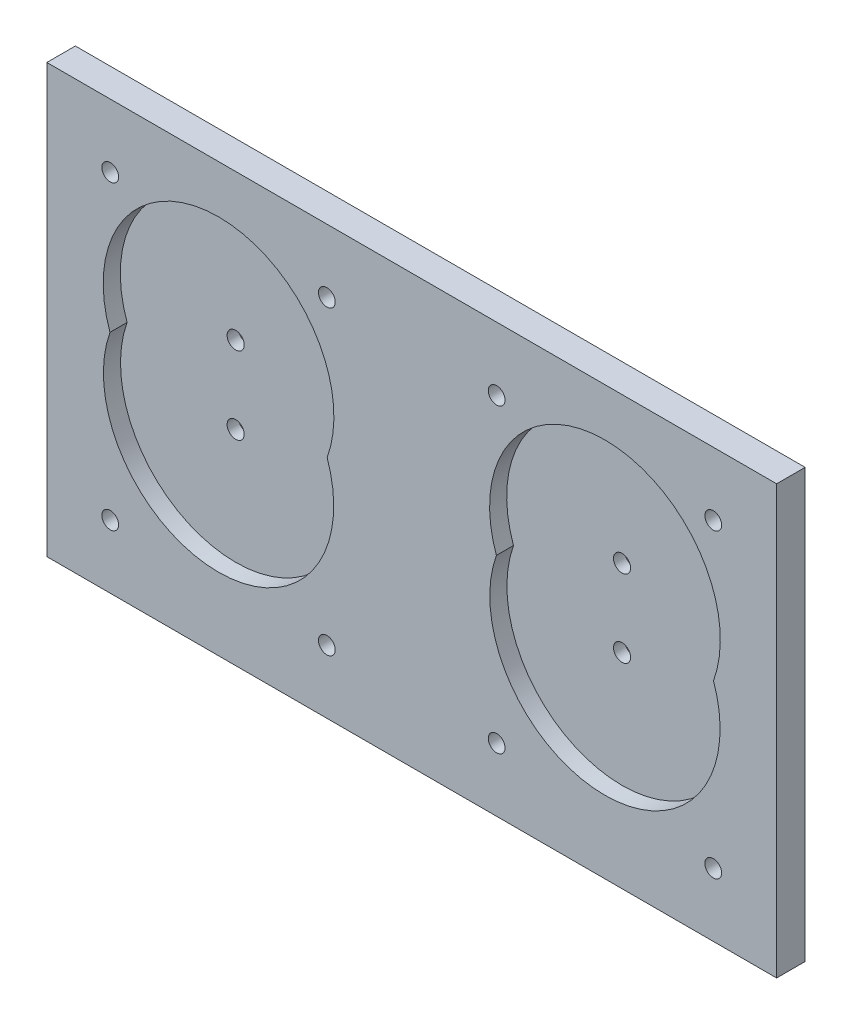
ISO-10303-21;
HEADER;
FILE_DESCRIPTION(('STEP AP214'),'2;1');
FILE_NAME('part.step','',(''),(''),'','','');
FILE_SCHEMA(('AUTOMOTIVE_DESIGN { 1 0 10303 214 1 1 1 1 }'));
ENDSEC;
DATA;
#1=APPLICATION_CONTEXT('core data for automotive mechanical design processes');
#2=APPLICATION_PROTOCOL_DEFINITION('international standard','automotive_design',2000,#1);
#3=PRODUCT_CONTEXT('',#1,'mechanical');
#4=PRODUCT('Part','Part','',(#3));
#5=PRODUCT_RELATED_PRODUCT_CATEGORY('part','',(#4));
#6=PRODUCT_DEFINITION_FORMATION('','',#4);
#7=PRODUCT_DEFINITION_CONTEXT('part definition',#1,'design');
#8=PRODUCT_DEFINITION('design','',#6,#7);
#9=PRODUCT_DEFINITION_SHAPE('','',#8);
#10=(LENGTH_UNIT() NAMED_UNIT(*) SI_UNIT(.MILLI.,.METRE.));
#11=(NAMED_UNIT(*) PLANE_ANGLE_UNIT() SI_UNIT($,.RADIAN.));
#12=(NAMED_UNIT(*) SI_UNIT($,.STERADIAN.) SOLID_ANGLE_UNIT());
#13=UNCERTAINTY_MEASURE_WITH_UNIT(LENGTH_MEASURE(1.E-05),#10,'distance_accuracy_value','');
#14=(GEOMETRIC_REPRESENTATION_CONTEXT(3) GLOBAL_UNCERTAINTY_ASSIGNED_CONTEXT((#13)) GLOBAL_UNIT_ASSIGNED_CONTEXT((#10,
#11,#12)) REPRESENTATION_CONTEXT('',''));
#15=CARTESIAN_POINT('',(0.,0.,0.));
#16=DIRECTION('',(0.,0.,1.));
#17=DIRECTION('',(1.,0.,0.));
#18=AXIS2_PLACEMENT_3D('',#15,#16,#17);
#19=CARTESIAN_POINT('',(-4.50000190126662,2.42973090307518,5.));
#20=DIRECTION('',(0.,0.,-1.));
#21=DIRECTION('',(-1.,0.,0.));
#22=AXIS2_PLACEMENT_3D('',#19,#20,#21);
#23=CYLINDRICAL_SURFACE('',#22,20.1998483211657);
#24=DIRECTION('',(0.,0.,-1.));
#25=VECTOR('',#24,1.);
#26=CARTESIAN_POINT('',(14.5464383030136,9.15780549710871,5.));
#27=LINE('',#26,#25);
#28=CARTESIAN_POINT('',(14.5464383030136,9.15780549710871,5.));
#29=VERTEX_POINT('',#28);
#30=CARTESIAN_POINT('',(14.5464383030136,9.15780549710871,2.));
#31=VERTEX_POINT('',#30);
#32=EDGE_CURVE('E51',#29,#31,#27,.T.);
#33=ORIENTED_EDGE('',*,*,#32,.T.);
#34=CARTESIAN_POINT('',(-4.50000190126662,2.42973090307518,2.));
#35=DIRECTION('',(0.,0.,-1.));
#36=DIRECTION('',(-1.,0.,0.));
#37=AXIS2_PLACEMENT_3D('',#34,#35,#36);
#38=CIRCLE('',#37,20.1998483211657);
#39=CARTESIAN_POINT('',(-23.5464817883785,9.15769315831589,2.));
#40=VERTEX_POINT('',#39);
#41=EDGE_CURVE('E58',#31,#40,#38,.T.);
#42=ORIENTED_EDGE('',*,*,#41,.T.);
#43=DIRECTION('',(0.,0.,-1.));
#44=VECTOR('',#43,1.);
#45=CARTESIAN_POINT('',(-23.5464817883785,9.15769315831589,5.));
#46=LINE('',#45,#44);
#47=CARTESIAN_POINT('',(-23.5464817883785,9.15769315831589,5.));
#48=VERTEX_POINT('',#47);
#49=EDGE_CURVE('E11',#48,#40,#46,.T.);
#50=ORIENTED_EDGE('',*,*,#49,.F.);
#51=CARTESIAN_POINT('',(-4.50000190126662,2.42973090307518,5.));
#52=DIRECTION('',(0.,0.,1.));
#53=DIRECTION('',(1.,0.,0.));
#54=AXIS2_PLACEMENT_3D('',#51,#52,#53);
#55=CIRCLE('',#54,20.1998483211657);
#56=EDGE_CURVE('E126',#48,#29,#55,.T.);
#57=ORIENTED_EDGE('',*,*,#56,.T.);
#58=EDGE_LOOP('',(#33,#42,#50,#57));
#59=FACE_BOUND('',#58,.T.);
#60=ADVANCED_FACE('F41',(#59),#23,.F.);
#61=CARTESIAN_POINT('',(-4.50004190388904,15.9942054839587,5.));
#62=DIRECTION('',(0.,0.,-1.));
#63=DIRECTION('',(-1.,0.,0.));
#64=AXIS2_PLACEMENT_3D('',#61,#62,#63);
#65=CYLINDRICAL_SURFACE('',#64,20.2362242785589);
#66=ORIENTED_EDGE('',*,*,#49,.T.);
#67=CARTESIAN_POINT('',(-4.50004190388904,15.9942054839587,2.));
#68=DIRECTION('',(0.,0.,-1.));
#69=DIRECTION('',(-1.,0.,0.));
#70=AXIS2_PLACEMENT_3D('',#67,#68,#69);
#71=CIRCLE('',#70,20.2362242785589);
#72=EDGE_CURVE('E106',#40,#31,#71,.T.);
#73=ORIENTED_EDGE('',*,*,#72,.T.);
#74=ORIENTED_EDGE('',*,*,#32,.F.);
#75=CARTESIAN_POINT('',(-4.50004190388904,15.9942054839587,5.));
#76=DIRECTION('',(0.,0.,1.));
#77=DIRECTION('',(1.,0.,0.));
#78=AXIS2_PLACEMENT_3D('',#75,#76,#77);
#79=CIRCLE('',#78,20.2362242785589);
#80=EDGE_CURVE('E122',#29,#48,#79,.T.);
#81=ORIENTED_EDGE('',*,*,#80,.T.);
#82=EDGE_LOOP('',(#66,#73,#74,#81));
#83=FACE_BOUND('',#82,.T.);
#84=ADVANCED_FACE('F120',(#83),#65,.F.);
#85=CARTESIAN_POINT('',(63.2845897595525,15.9942054839587,5.));
#86=DIRECTION('',(0.,0.,-1.));
#87=DIRECTION('',(-1.,0.,0.));
#88=AXIS2_PLACEMENT_3D('',#85,#86,#87);
#89=CYLINDRICAL_SURFACE('',#88,20.2362242785589);
#90=DIRECTION('',(0.,0.,-1.));
#91=VECTOR('',#90,1.);
#92=CARTESIAN_POINT('',(44.2381095526499,9.15780549710872,5.));
#93=LINE('',#92,#91);
#94=CARTESIAN_POINT('',(44.2381095526499,9.15780549710872,5.));
#95=VERTEX_POINT('',#94);
#96=CARTESIAN_POINT('',(44.2381095526499,9.15780549710872,2.));
#97=VERTEX_POINT('',#96);
#98=EDGE_CURVE('E125',#95,#97,#93,.T.);
#99=ORIENTED_EDGE('',*,*,#98,.T.);
#100=CARTESIAN_POINT('',(63.2845897595525,15.9942054839587,2.));
#101=DIRECTION('',(0.,0.,-1.));
#102=DIRECTION('',(-1.,0.,0.));
#103=AXIS2_PLACEMENT_3D('',#100,#101,#102);
#104=CIRCLE('',#103,20.2362242785589);
#105=CARTESIAN_POINT('',(82.3310296440419,9.15769315831589,2.));
#106=VERTEX_POINT('',#105);
#107=EDGE_CURVE('E65',#97,#106,#104,.T.);
#108=ORIENTED_EDGE('',*,*,#107,.T.);
#109=DIRECTION('',(0.,0.,-1.));
#110=VECTOR('',#109,1.);
#111=CARTESIAN_POINT('',(82.3310296440419,9.15769315831588,5.));
#112=LINE('',#111,#110);
#113=CARTESIAN_POINT('',(82.3310296440419,9.15769315831588,5.));
#114=VERTEX_POINT('',#113);
#115=EDGE_CURVE('E131',#114,#106,#112,.T.);
#116=ORIENTED_EDGE('',*,*,#115,.F.);
#117=CARTESIAN_POINT('',(63.2845897595525,15.9942054839587,5.));
#118=DIRECTION('',(0.,0.,1.));
#119=DIRECTION('',(1.,0.,0.));
#120=AXIS2_PLACEMENT_3D('',#117,#118,#119);
#121=CIRCLE('',#120,20.2362242785589);
#122=EDGE_CURVE('E153',#114,#95,#121,.T.);
#123=ORIENTED_EDGE('',*,*,#122,.T.);
#124=EDGE_LOOP('',(#99,#108,#116,#123));
#125=FACE_BOUND('',#124,.T.);
#126=ADVANCED_FACE('F43',(#125),#89,.F.);
#127=CARTESIAN_POINT('',(63.28454975693,2.42973090307519,5.));
#128=DIRECTION('',(0.,0.,-1.));
#129=DIRECTION('',(-1.,0.,0.));
#130=AXIS2_PLACEMENT_3D('',#127,#128,#129);
#131=CYLINDRICAL_SURFACE('',#130,20.1998483211657);
#132=ORIENTED_EDGE('',*,*,#115,.T.);
#133=CARTESIAN_POINT('',(63.28454975693,2.42973090307519,2.));
#134=DIRECTION('',(0.,0.,-1.));
#135=DIRECTION('',(-1.,0.,0.));
#136=AXIS2_PLACEMENT_3D('',#133,#134,#135);
#137=CIRCLE('',#136,20.1998483211657);
#138=EDGE_CURVE('E259',#106,#97,#137,.T.);
#139=ORIENTED_EDGE('',*,*,#138,.T.);
#140=ORIENTED_EDGE('',*,*,#98,.F.);
#141=CARTESIAN_POINT('',(63.28454975693,2.42973090307519,5.));
#142=DIRECTION('',(0.,0.,1.));
#143=DIRECTION('',(1.,0.,0.));
#144=AXIS2_PLACEMENT_3D('',#141,#142,#143);
#145=CIRCLE('',#144,20.1998483211657);
#146=EDGE_CURVE('E261',#95,#114,#145,.T.);
#147=ORIENTED_EDGE('',*,*,#146,.T.);
#148=EDGE_LOOP('',(#132,#139,#140,#147));
#149=FACE_BOUND('',#148,.T.);
#150=ADVANCED_FACE('F249',(#149),#131,.F.);
#151=CARTESIAN_POINT('',(0.,44.6200004768371,5.));
#152=DIRECTION('',(0.,1.,0.));
#153=DIRECTION('',(0.,0.,1.));
#154=AXIS2_PLACEMENT_3D('',#151,#152,#153);
#155=PLANE('',#154);
#156=DIRECTION('',(1.,0.,0.));
#157=VECTOR('',#156,1.);
#158=CARTESIAN_POINT('',(0.,44.6200004768371,0.));
#159=LINE('',#158,#157);
#160=CARTESIAN_POINT('',(-34.6200007003546,44.6200004768371,0.));
#161=VERTEX_POINT('',#160);
#162=CARTESIAN_POINT('',(93.404548556018,44.6200004768371,0.));
#163=VERTEX_POINT('',#162);
#164=EDGE_CURVE('E137',#161,#163,#159,.T.);
#165=ORIENTED_EDGE('',*,*,#164,.F.);
#166=DIRECTION('',(0.,0.,-1.));
#167=VECTOR('',#166,1.);
#168=CARTESIAN_POINT('',(-34.6200007003546,44.6200004768371,5.));
#169=LINE('',#168,#167);
#170=CARTESIAN_POINT('',(-34.6200007003546,44.6200004768371,5.));
#171=VERTEX_POINT('',#170);
#172=EDGE_CURVE('E155',#171,#161,#169,.T.);
#173=ORIENTED_EDGE('',*,*,#172,.F.);
#174=DIRECTION('',(1.,0.,0.));
#175=VECTOR('',#174,1.);
#176=CARTESIAN_POINT('',(0.,44.6200004768371,5.));
#177=LINE('',#176,#175);
#178=CARTESIAN_POINT('',(93.404548556018,44.6200004768371,5.));
#179=VERTEX_POINT('',#178);
#180=EDGE_CURVE('E269',#171,#179,#177,.T.);
#181=ORIENTED_EDGE('',*,*,#180,.T.);
#182=DIRECTION('',(0.,0.,-1.));
#183=VECTOR('',#182,1.);
#184=CARTESIAN_POINT('',(93.404548556018,44.6200004768371,5.));
#185=LINE('',#184,#183);
#186=EDGE_CURVE('E157',#179,#163,#185,.T.);
#187=ORIENTED_EDGE('',*,*,#186,.T.);
#188=EDGE_LOOP('',(#165,#173,#181,#187));
#189=FACE_BOUND('',#188,.T.);
#190=ADVANCED_FACE('F246',(#189),#155,.T.);
#191=CARTESIAN_POINT('',(-34.6200007003546,0.,5.));
#192=DIRECTION('',(-1.,0.,0.));
#193=DIRECTION('',(0.,0.,1.));
#194=AXIS2_PLACEMENT_3D('',#191,#192,#193);
#195=PLANE('',#194);
#196=DIRECTION('',(0.,1.,0.));
#197=VECTOR('',#196,1.);
#198=CARTESIAN_POINT('',(-34.6200007003546,0.,0.));
#199=LINE('',#198,#197);
#200=CARTESIAN_POINT('',(-34.6200007003546,-30.4650000286103,0.));
#201=VERTEX_POINT('',#200);
#202=EDGE_CURVE('E141',#201,#161,#199,.T.);
#203=ORIENTED_EDGE('',*,*,#202,.F.);
#204=DIRECTION('',(0.,0.,-1.));
#205=VECTOR('',#204,1.);
#206=CARTESIAN_POINT('',(-34.6200007003546,-30.4650000286103,5.));
#207=LINE('',#206,#205);
#208=CARTESIAN_POINT('',(-34.6200007003546,-30.4650000286103,5.));
#209=VERTEX_POINT('',#208);
#210=EDGE_CURVE('E164',#209,#201,#207,.T.);
#211=ORIENTED_EDGE('',*,*,#210,.F.);
#212=DIRECTION('',(0.,1.,0.));
#213=VECTOR('',#212,1.);
#214=CARTESIAN_POINT('',(-34.6200007003546,0.,5.));
#215=LINE('',#214,#213);
#216=EDGE_CURVE('E277',#209,#171,#215,.T.);
#217=ORIENTED_EDGE('',*,*,#216,.T.);
#218=ORIENTED_EDGE('',*,*,#172,.T.);
#219=EDGE_LOOP('',(#203,#211,#217,#218));
#220=FACE_BOUND('',#219,.T.);
#221=ADVANCED_FACE('F242',(#220),#195,.T.);
#222=CARTESIAN_POINT('',(0.,-30.4650000286103,5.));
#223=DIRECTION('',(0.,1.,0.));
#224=DIRECTION('',(0.,0.,1.));
#225=AXIS2_PLACEMENT_3D('',#222,#223,#224);
#226=PLANE('',#225);
#227=DIRECTION('',(1.,0.,0.));
#228=VECTOR('',#227,1.);
#229=CARTESIAN_POINT('',(0.,-30.4650000286103,0.));
#230=LINE('',#229,#228);
#231=CARTESIAN_POINT('',(93.404548556018,-30.4650000286103,0.));
#232=VERTEX_POINT('',#231);
#233=EDGE_CURVE('E145',#201,#232,#230,.T.);
#234=ORIENTED_EDGE('',*,*,#233,.T.);
#235=DIRECTION('',(0.,0.,-1.));
#236=VECTOR('',#235,1.);
#237=CARTESIAN_POINT('',(93.404548556018,-30.4650000286103,5.));
#238=LINE('',#237,#236);
#239=CARTESIAN_POINT('',(93.404548556018,-30.4650000286103,5.));
#240=VERTEX_POINT('',#239);
#241=EDGE_CURVE('E160',#240,#232,#238,.T.);
#242=ORIENTED_EDGE('',*,*,#241,.F.);
#243=DIRECTION('',(1.,0.,0.));
#244=VECTOR('',#243,1.);
#245=CARTESIAN_POINT('',(0.,-30.4650000286103,5.));
#246=LINE('',#245,#244);
#247=EDGE_CURVE('E281',#209,#240,#246,.T.);
#248=ORIENTED_EDGE('',*,*,#247,.F.);
#249=ORIENTED_EDGE('',*,*,#210,.T.);
#250=EDGE_LOOP('',(#234,#242,#248,#249));
#251=FACE_BOUND('',#250,.T.);
#252=ADVANCED_FACE('F238',(#251),#226,.F.);
#253=CARTESIAN_POINT('',(93.404548556018,0.,5.));
#254=DIRECTION('',(-1.,0.,0.));
#255=DIRECTION('',(0.,0.,1.));
#256=AXIS2_PLACEMENT_3D('',#253,#254,#255);
#257=PLANE('',#256);
#258=DIRECTION('',(0.,1.,0.));
#259=VECTOR('',#258,1.);
#260=CARTESIAN_POINT('',(93.404548556018,0.,0.));
#261=LINE('',#260,#259);
#262=EDGE_CURVE('E149',#232,#163,#261,.T.);
#263=ORIENTED_EDGE('',*,*,#262,.T.);
#264=ORIENTED_EDGE('',*,*,#186,.F.);
#265=DIRECTION('',(0.,1.,0.));
#266=VECTOR('',#265,1.);
#267=CARTESIAN_POINT('',(93.404548556018,0.,5.));
#268=LINE('',#267,#266);
#269=EDGE_CURVE('E133',#240,#179,#268,.T.);
#270=ORIENTED_EDGE('',*,*,#269,.F.);
#271=ORIENTED_EDGE('',*,*,#241,.T.);
#272=EDGE_LOOP('',(#263,#264,#270,#271));
#273=FACE_BOUND('',#272,.T.);
#274=ADVANCED_FACE('F234',(#273),#257,.F.);
#275=CARTESIAN_POINT('',(0.,0.,5.));
#276=DIRECTION('',(0.,0.,1.));
#277=DIRECTION('',(1.,0.,0.));
#278=AXIS2_PLACEMENT_3D('',#275,#276,#277);
#279=PLANE('',#278);
#280=CARTESIAN_POINT('',(44.2848296858068,-19.345328378687,5.));
#281=DIRECTION('',(0.,0.,1.));
#282=DIRECTION('',(1.,0.,0.));
#283=AXIS2_PLACEMENT_3D('',#280,#281,#282);
#284=CIRCLE('',#283,1.4732);
#285=CARTESIAN_POINT('',(45.7580296858068,-19.345328378687,5.));
#286=VERTEX_POINT('',#285);
#287=EDGE_CURVE('E344',#286,#286,#284,.T.);
#288=ORIENTED_EDGE('',*,*,#287,.F.);
#289=EDGE_LOOP('',(#288));
#290=FACE_BOUND('',#289,.T.);
#291=CARTESIAN_POINT('',(14.5004063792218,-19.3447278658598,5.));
#292=DIRECTION('',(0.,0.,1.));
#293=DIRECTION('',(1.,0.,0.));
#294=AXIS2_PLACEMENT_3D('',#291,#292,#293);
#295=CIRCLE('',#294,1.4732);
#296=CARTESIAN_POINT('',(15.9736063792218,-19.3447278658598,5.));
#297=VERTEX_POINT('',#296);
#298=EDGE_CURVE('E352',#297,#297,#295,.T.);
#299=ORIENTED_EDGE('',*,*,#298,.F.);
#300=EDGE_LOOP('',(#299));
#301=FACE_BOUND('',#300,.T.);
#302=CARTESIAN_POINT('',(-23.4995935395913,-19.345440441422,5.));
#303=DIRECTION('',(0.,0.,1.));
#304=DIRECTION('',(1.,0.,0.));
#305=AXIS2_PLACEMENT_3D('',#302,#303,#304);
#306=CIRCLE('',#305,1.4732);
#307=CARTESIAN_POINT('',(-22.0263935395913,-19.345440441422,5.));
#308=VERTEX_POINT('',#307);
#309=EDGE_CURVE('E356',#308,#308,#306,.T.);
#310=ORIENTED_EDGE('',*,*,#309,.F.);
#311=EDGE_LOOP('',(#310));
#312=FACE_BOUND('',#311,.T.);
#313=CARTESIAN_POINT('',(14.4994154303793,33.5002726302965,5.));
#314=DIRECTION('',(0.,0.,1.));
#315=DIRECTION('',(1.,0.,0.));
#316=AXIS2_PLACEMENT_3D('',#313,#314,#315);
#317=CIRCLE('',#316,1.4732);
#318=CARTESIAN_POINT('',(15.9726154303793,33.5002726302965,5.));
#319=VERTEX_POINT('',#318);
#320=EDGE_CURVE('E359',#319,#319,#317,.T.);
#321=ORIENTED_EDGE('',*,*,#320,.F.);
#322=EDGE_LOOP('',(#321));
#323=FACE_BOUND('',#322,.T.);
#324=CARTESIAN_POINT('',(44.2841504244668,33.4996721223948,5.));
#325=DIRECTION('',(0.,0.,1.));
#326=DIRECTION('',(1.,0.,0.));
#327=AXIS2_PLACEMENT_3D('',#324,#325,#326);
#328=CIRCLE('',#327,1.4732);
#329=CARTESIAN_POINT('',(45.7573504244668,33.4996721223948,5.));
#330=VERTEX_POINT('',#329);
#331=EDGE_CURVE('E340',#330,#330,#328,.T.);
#332=ORIENTED_EDGE('',*,*,#331,.F.);
#333=EDGE_LOOP('',(#332));
#334=FACE_BOUND('',#333,.T.);
#335=CARTESIAN_POINT('',(82.2841503468217,33.500160568428,5.));
#336=DIRECTION('',(0.,0.,1.));
#337=DIRECTION('',(1.,0.,0.));
#338=AXIS2_PLACEMENT_3D('',#335,#336,#337);
#339=CIRCLE('',#338,1.4732);
#340=CARTESIAN_POINT('',(83.7573503468218,33.500160568428,5.));
#341=VERTEX_POINT('',#340);
#342=EDGE_CURVE('E345',#341,#341,#339,.T.);
#343=ORIENTED_EDGE('',*,*,#342,.F.);
#344=EDGE_LOOP('',(#343));
#345=FACE_BOUND('',#344,.T.);
#346=CARTESIAN_POINT('',(82.2848296081617,-19.3448399326539,5.));
#347=DIRECTION('',(0.,0.,1.));
#348=DIRECTION('',(1.,0.,0.));
#349=AXIS2_PLACEMENT_3D('',#346,#347,#348);
#350=CIRCLE('',#349,1.4732);
#351=CARTESIAN_POINT('',(83.7580296081617,-19.3448399326539,5.));
#352=VERTEX_POINT('',#351);
#353=EDGE_CURVE('E339',#352,#352,#350,.T.);
#354=ORIENTED_EDGE('',*,*,#353,.F.);
#355=EDGE_LOOP('',(#354));
#356=FACE_BOUND('',#355,.T.);
#357=CARTESIAN_POINT('',(-23.5005844884338,33.4995600547343,5.));
#358=DIRECTION('',(0.,0.,1.));
#359=DIRECTION('',(1.,0.,0.));
#360=AXIS2_PLACEMENT_3D('',#357,#358,#359);
#361=CIRCLE('',#360,1.4732);
#362=CARTESIAN_POINT('',(-22.0273844884338,33.4995600547343,5.));
#363=VERTEX_POINT('',#362);
#364=EDGE_CURVE('E177',#363,#363,#361,.T.);
#365=ORIENTED_EDGE('',*,*,#364,.F.);
#366=EDGE_LOOP('',(#365));
#367=FACE_BOUND('',#366,.T.);
#368=ORIENTED_EDGE('',*,*,#122,.F.);
#369=ORIENTED_EDGE('',*,*,#146,.F.);
#370=EDGE_LOOP('',(#368,#369));
#371=FACE_BOUND('',#370,.T.);
#372=ORIENTED_EDGE('',*,*,#180,.F.);
#373=ORIENTED_EDGE('',*,*,#216,.F.);
#374=ORIENTED_EDGE('',*,*,#247,.T.);
#375=ORIENTED_EDGE('',*,*,#269,.T.);
#376=EDGE_LOOP('',(#372,#373,#374,#375));
#377=FACE_BOUND('',#376,.T.);
#378=ORIENTED_EDGE('',*,*,#56,.F.);
#379=ORIENTED_EDGE('',*,*,#80,.F.);
#380=EDGE_LOOP('',(#378,#379));
#381=FACE_BOUND('',#380,.T.);
#382=ADVANCED_FACE('F237',(#290,#301,#312,#323,#334,#345,#356,#367,#371,#377,#381),#279,.T.);
#383=CARTESIAN_POINT('',(0.,0.,0.));
#384=DIRECTION('',(0.,0.,1.));
#385=DIRECTION('',(1.,0.,0.));
#386=AXIS2_PLACEMENT_3D('',#383,#384,#385);
#387=PLANE('',#386);
#388=CARTESIAN_POINT('',(44.2848296858068,-19.345328378687,0.));
#389=DIRECTION('',(0.,0.,1.));
#390=DIRECTION('',(1.,0.,0.));
#391=AXIS2_PLACEMENT_3D('',#388,#389,#390);
#392=CIRCLE('',#391,1.4732);
#393=CARTESIAN_POINT('',(45.7580296858068,-19.345328378687,0.));
#394=VERTEX_POINT('',#393);
#395=EDGE_CURVE('E45',#394,#394,#392,.T.);
#396=ORIENTED_EDGE('',*,*,#395,.T.);
#397=EDGE_LOOP('',(#396));
#398=FACE_BOUND('',#397,.T.);
#399=CARTESIAN_POINT('',(14.5004063792218,-19.3447278658598,0.));
#400=DIRECTION('',(0.,0.,1.));
#401=DIRECTION('',(1.,0.,0.));
#402=AXIS2_PLACEMENT_3D('',#399,#400,#401);
#403=CIRCLE('',#402,1.4732);
#404=CARTESIAN_POINT('',(15.9736063792218,-19.3447278658598,0.));
#405=VERTEX_POINT('',#404);
#406=EDGE_CURVE('E196',#405,#405,#403,.T.);
#407=ORIENTED_EDGE('',*,*,#406,.T.);
#408=EDGE_LOOP('',(#407));
#409=FACE_BOUND('',#408,.T.);
#410=CARTESIAN_POINT('',(-23.4995935395913,-19.345440441422,0.));
#411=DIRECTION('',(0.,0.,1.));
#412=DIRECTION('',(1.,0.,0.));
#413=AXIS2_PLACEMENT_3D('',#410,#411,#412);
#414=CIRCLE('',#413,1.4732);
#415=CARTESIAN_POINT('',(-22.0263935395913,-19.345440441422,0.));
#416=VERTEX_POINT('',#415);
#417=EDGE_CURVE('E193',#416,#416,#414,.T.);
#418=ORIENTED_EDGE('',*,*,#417,.T.);
#419=EDGE_LOOP('',(#418));
#420=FACE_BOUND('',#419,.T.);
#421=CARTESIAN_POINT('',(14.4994154303793,33.5002726302965,0.));
#422=DIRECTION('',(0.,0.,1.));
#423=DIRECTION('',(1.,0.,0.));
#424=AXIS2_PLACEMENT_3D('',#421,#422,#423);
#425=CIRCLE('',#424,1.4732);
#426=CARTESIAN_POINT('',(15.9726154303793,33.5002726302965,0.));
#427=VERTEX_POINT('',#426);
#428=EDGE_CURVE('E189',#427,#427,#425,.T.);
#429=ORIENTED_EDGE('',*,*,#428,.T.);
#430=EDGE_LOOP('',(#429));
#431=FACE_BOUND('',#430,.T.);
#432=CARTESIAN_POINT('',(44.2841504244668,33.4996721223948,0.));
#433=DIRECTION('',(0.,0.,1.));
#434=DIRECTION('',(1.,0.,0.));
#435=AXIS2_PLACEMENT_3D('',#432,#433,#434);
#436=CIRCLE('',#435,1.4732);
#437=CARTESIAN_POINT('',(45.7573504244668,33.4996721223948,0.));
#438=VERTEX_POINT('',#437);
#439=EDGE_CURVE('E185',#438,#438,#436,.T.);
#440=ORIENTED_EDGE('',*,*,#439,.T.);
#441=EDGE_LOOP('',(#440));
#442=FACE_BOUND('',#441,.T.);
#443=CARTESIAN_POINT('',(82.2841503468217,33.500160568428,0.));
#444=DIRECTION('',(0.,0.,1.));
#445=DIRECTION('',(1.,0.,0.));
#446=AXIS2_PLACEMENT_3D('',#443,#444,#445);
#447=CIRCLE('',#446,1.4732);
#448=CARTESIAN_POINT('',(83.7573503468218,33.500160568428,0.));
#449=VERTEX_POINT('',#448);
#450=EDGE_CURVE('E181',#449,#449,#447,.T.);
#451=ORIENTED_EDGE('',*,*,#450,.T.);
#452=EDGE_LOOP('',(#451));
#453=FACE_BOUND('',#452,.T.);
#454=CARTESIAN_POINT('',(82.2848296081617,-19.3448399326539,0.));
#455=DIRECTION('',(0.,0.,1.));
#456=DIRECTION('',(1.,0.,0.));
#457=AXIS2_PLACEMENT_3D('',#454,#455,#456);
#458=CIRCLE('',#457,1.4732);
#459=CARTESIAN_POINT('',(83.7580296081617,-19.3448399326539,0.));
#460=VERTEX_POINT('',#459);
#461=EDGE_CURVE('E176',#460,#460,#458,.T.);
#462=ORIENTED_EDGE('',*,*,#461,.T.);
#463=EDGE_LOOP('',(#462));
#464=FACE_BOUND('',#463,.T.);
#465=CARTESIAN_POINT('',(-23.5005844884338,33.4995600547343,0.));
#466=DIRECTION('',(0.,0.,1.));
#467=DIRECTION('',(1.,0.,0.));
#468=AXIS2_PLACEMENT_3D('',#465,#466,#467);
#469=CIRCLE('',#468,1.4732);
#470=CARTESIAN_POINT('',(-22.0273844884338,33.4995600547343,0.));
#471=VERTEX_POINT('',#470);
#472=EDGE_CURVE('E172',#471,#471,#469,.T.);
#473=ORIENTED_EDGE('',*,*,#472,.T.);
#474=EDGE_LOOP('',(#473));
#475=FACE_BOUND('',#474,.T.);
#476=ORIENTED_EDGE('',*,*,#164,.T.);
#477=ORIENTED_EDGE('',*,*,#262,.F.);
#478=ORIENTED_EDGE('',*,*,#233,.F.);
#479=ORIENTED_EDGE('',*,*,#202,.T.);
#480=EDGE_LOOP('',(#476,#477,#478,#479));
#481=FACE_BOUND('',#480,.T.);
#482=CARTESIAN_POINT('',(63.2845897595525,15.9942054839587,0.));
#483=DIRECTION('',(0.,0.,-1.));
#484=DIRECTION('',(-1.,0.,0.));
#485=AXIS2_PLACEMENT_3D('',#482,#483,#484);
#486=CIRCLE('',#485,1.5);
#487=CARTESIAN_POINT('',(61.7845897595525,15.9942054839587,0.));
#488=VERTEX_POINT('',#487);
#489=EDGE_CURVE('E111',#488,#488,#486,.T.);
#490=ORIENTED_EDGE('',*,*,#489,.F.);
#491=EDGE_LOOP('',(#490));
#492=FACE_BOUND('',#491,.T.);
#493=CARTESIAN_POINT('',(63.28454975693,2.42973090307519,0.));
#494=DIRECTION('',(0.,0.,-1.));
#495=DIRECTION('',(-1.,0.,0.));
#496=AXIS2_PLACEMENT_3D('',#493,#494,#495);
#497=CIRCLE('',#496,1.5);
#498=CARTESIAN_POINT('',(61.78454975693,2.42973090307519,0.));
#499=VERTEX_POINT('',#498);
#500=EDGE_CURVE('E303',#499,#499,#497,.T.);
#501=ORIENTED_EDGE('',*,*,#500,.F.);
#502=EDGE_LOOP('',(#501));
#503=FACE_BOUND('',#502,.T.);
#504=CARTESIAN_POINT('',(-4.50000190126662,2.42973090307518,0.));
#505=DIRECTION('',(0.,0.,-1.));
#506=DIRECTION('',(-1.,0.,0.));
#507=AXIS2_PLACEMENT_3D('',#504,#505,#506);
#508=CIRCLE('',#507,1.5);
#509=CARTESIAN_POINT('',(-6.00000190126662,2.42973090307518,0.));
#510=VERTEX_POINT('',#509);
#511=EDGE_CURVE('E307',#510,#510,#508,.T.);
#512=ORIENTED_EDGE('',*,*,#511,.F.);
#513=EDGE_LOOP('',(#512));
#514=FACE_BOUND('',#513,.T.);
#515=CARTESIAN_POINT('',(-4.50004190388904,15.9942054839587,0.));
#516=DIRECTION('',(0.,0.,-1.));
#517=DIRECTION('',(-1.,0.,0.));
#518=AXIS2_PLACEMENT_3D('',#515,#516,#517);
#519=CIRCLE('',#518,1.5);
#520=CARTESIAN_POINT('',(-6.00004190388904,15.9942054839587,0.));
#521=VERTEX_POINT('',#520);
#522=EDGE_CURVE('E310',#521,#521,#519,.T.);
#523=ORIENTED_EDGE('',*,*,#522,.F.);
#524=EDGE_LOOP('',(#523));
#525=FACE_BOUND('',#524,.T.);
#526=ADVANCED_FACE('F205',(#398,#409,#420,#431,#442,#453,#464,#475,#481,#492,#503,#514,#525),
#387,.F.);
#527=CARTESIAN_POINT('',(-23.5005844884338,33.4995600547343,-5.));
#528=DIRECTION('',(0.,0.,1.));
#529=DIRECTION('',(1.,0.,0.));
#530=AXIS2_PLACEMENT_3D('',#527,#528,#529);
#531=CYLINDRICAL_SURFACE('',#530,1.4732);
#532=ORIENTED_EDGE('',*,*,#364,.T.);
#533=EDGE_LOOP('',(#532));
#534=FACE_BOUND('',#533,.T.);
#535=ORIENTED_EDGE('',*,*,#472,.F.);
#536=EDGE_LOOP('',(#535));
#537=FACE_BOUND('',#536,.T.);
#538=ADVANCED_FACE('F296',(#534,#537),#531,.F.);
#539=CARTESIAN_POINT('',(82.2848296081617,-19.3448399326539,-5.));
#540=DIRECTION('',(0.,0.,1.));
#541=DIRECTION('',(1.,0.,0.));
#542=AXIS2_PLACEMENT_3D('',#539,#540,#541);
#543=CYLINDRICAL_SURFACE('',#542,1.4732);
#544=ORIENTED_EDGE('',*,*,#353,.T.);
#545=EDGE_LOOP('',(#544));
#546=FACE_BOUND('',#545,.T.);
#547=ORIENTED_EDGE('',*,*,#461,.F.);
#548=EDGE_LOOP('',(#547));
#549=FACE_BOUND('',#548,.T.);
#550=ADVANCED_FACE('F386',(#546,#549),#543,.F.);
#551=CARTESIAN_POINT('',(82.2841503468217,33.500160568428,-5.));
#552=DIRECTION('',(0.,0.,1.));
#553=DIRECTION('',(1.,0.,0.));
#554=AXIS2_PLACEMENT_3D('',#551,#552,#553);
#555=CYLINDRICAL_SURFACE('',#554,1.4732);
#556=ORIENTED_EDGE('',*,*,#342,.T.);
#557=EDGE_LOOP('',(#556));
#558=FACE_BOUND('',#557,.T.);
#559=ORIENTED_EDGE('',*,*,#450,.F.);
#560=EDGE_LOOP('',(#559));
#561=FACE_BOUND('',#560,.T.);
#562=ADVANCED_FACE('F393',(#558,#561),#555,.F.);
#563=CARTESIAN_POINT('',(44.2841504244668,33.4996721223948,-5.));
#564=DIRECTION('',(0.,0.,1.));
#565=DIRECTION('',(1.,0.,0.));
#566=AXIS2_PLACEMENT_3D('',#563,#564,#565);
#567=CYLINDRICAL_SURFACE('',#566,1.4732);
#568=ORIENTED_EDGE('',*,*,#331,.T.);
#569=EDGE_LOOP('',(#568));
#570=FACE_BOUND('',#569,.T.);
#571=ORIENTED_EDGE('',*,*,#439,.F.);
#572=EDGE_LOOP('',(#571));
#573=FACE_BOUND('',#572,.T.);
#574=ADVANCED_FACE('F400',(#570,#573),#567,.F.);
#575=CARTESIAN_POINT('',(14.4994154303793,33.5002726302965,-5.));
#576=DIRECTION('',(0.,0.,1.));
#577=DIRECTION('',(1.,0.,0.));
#578=AXIS2_PLACEMENT_3D('',#575,#576,#577);
#579=CYLINDRICAL_SURFACE('',#578,1.4732);
#580=ORIENTED_EDGE('',*,*,#320,.T.);
#581=EDGE_LOOP('',(#580));
#582=FACE_BOUND('',#581,.T.);
#583=ORIENTED_EDGE('',*,*,#428,.F.);
#584=EDGE_LOOP('',(#583));
#585=FACE_BOUND('',#584,.T.);
#586=ADVANCED_FACE('F398',(#582,#585),#579,.F.);
#587=CARTESIAN_POINT('',(-23.4995935395913,-19.345440441422,-5.));
#588=DIRECTION('',(0.,0.,1.));
#589=DIRECTION('',(1.,0.,0.));
#590=AXIS2_PLACEMENT_3D('',#587,#588,#589);
#591=CYLINDRICAL_SURFACE('',#590,1.4732);
#592=ORIENTED_EDGE('',*,*,#309,.T.);
#593=EDGE_LOOP('',(#592));
#594=FACE_BOUND('',#593,.T.);
#595=ORIENTED_EDGE('',*,*,#417,.F.);
#596=EDGE_LOOP('',(#595));
#597=FACE_BOUND('',#596,.T.);
#598=ADVANCED_FACE('F221',(#594,#597),#591,.F.);
#599=CARTESIAN_POINT('',(14.5004063792218,-19.3447278658598,-5.));
#600=DIRECTION('',(0.,0.,1.));
#601=DIRECTION('',(1.,0.,0.));
#602=AXIS2_PLACEMENT_3D('',#599,#600,#601);
#603=CYLINDRICAL_SURFACE('',#602,1.4732);
#604=ORIENTED_EDGE('',*,*,#298,.T.);
#605=EDGE_LOOP('',(#604));
#606=FACE_BOUND('',#605,.T.);
#607=ORIENTED_EDGE('',*,*,#406,.F.);
#608=EDGE_LOOP('',(#607));
#609=FACE_BOUND('',#608,.T.);
#610=ADVANCED_FACE('F210',(#606,#609),#603,.F.);
#611=CARTESIAN_POINT('',(44.2848296858068,-19.345328378687,-5.));
#612=DIRECTION('',(0.,0.,1.));
#613=DIRECTION('',(1.,0.,0.));
#614=AXIS2_PLACEMENT_3D('',#611,#612,#613);
#615=CYLINDRICAL_SURFACE('',#614,1.4732);
#616=ORIENTED_EDGE('',*,*,#287,.T.);
#617=EDGE_LOOP('',(#616));
#618=FACE_BOUND('',#617,.T.);
#619=ORIENTED_EDGE('',*,*,#395,.F.);
#620=EDGE_LOOP('',(#619));
#621=FACE_BOUND('',#620,.T.);
#622=ADVANCED_FACE('F207',(#618,#621),#615,.F.);
#623=CARTESIAN_POINT('',(63.2845697582413,9.21196819351694,2.));
#624=DIRECTION('',(0.,0.,-1.));
#625=DIRECTION('',(-1.,0.,0.));
#626=AXIS2_PLACEMENT_3D('',#623,#624,#625);
#627=PLANE('',#626);
#628=CARTESIAN_POINT('',(63.2845897595525,15.9942054839587,2.));
#629=DIRECTION('',(0.,0.,-1.));
#630=DIRECTION('',(-1.,0.,0.));
#631=AXIS2_PLACEMENT_3D('',#628,#629,#630);
#632=CIRCLE('',#631,1.5);
#633=CARTESIAN_POINT('',(61.7845897595525,15.9942054839587,2.));
#634=VERTEX_POINT('',#633);
#635=EDGE_CURVE('E323',#634,#634,#632,.T.);
#636=ORIENTED_EDGE('',*,*,#635,.T.);
#637=EDGE_LOOP('',(#636));
#638=FACE_BOUND('',#637,.T.);
#639=CARTESIAN_POINT('',(63.28454975693,2.42973090307519,2.));
#640=DIRECTION('',(0.,0.,-1.));
#641=DIRECTION('',(-1.,0.,0.));
#642=AXIS2_PLACEMENT_3D('',#639,#640,#641);
#643=CIRCLE('',#642,1.5);
#644=CARTESIAN_POINT('',(61.78454975693,2.42973090307519,2.));
#645=VERTEX_POINT('',#644);
#646=EDGE_CURVE('E329',#645,#645,#643,.T.);
#647=ORIENTED_EDGE('',*,*,#646,.T.);
#648=EDGE_LOOP('',(#647));
#649=FACE_BOUND('',#648,.T.);
#650=ORIENTED_EDGE('',*,*,#138,.F.);
#651=ORIENTED_EDGE('',*,*,#107,.F.);
#652=EDGE_LOOP('',(#650,#651));
#653=FACE_BOUND('',#652,.T.);
#654=ADVANCED_FACE('F209',(#638,#649,#653),#627,.F.);
#655=CARTESIAN_POINT('',(63.28454975693,2.42973090307519,2.));
#656=DIRECTION('',(0.,0.,-1.));
#657=DIRECTION('',(-1.,0.,0.));
#658=AXIS2_PLACEMENT_3D('',#655,#656,#657);
#659=CYLINDRICAL_SURFACE('',#658,1.5);
#660=ORIENTED_EDGE('',*,*,#646,.F.);
#661=EDGE_LOOP('',(#660));
#662=FACE_BOUND('',#661,.T.);
#663=ORIENTED_EDGE('',*,*,#500,.T.);
#664=EDGE_LOOP('',(#663));
#665=FACE_BOUND('',#664,.T.);
#666=ADVANCED_FACE('F218',(#662,#665),#659,.F.);
#667=CARTESIAN_POINT('',(63.2845897595525,15.9942054839587,2.));
#668=DIRECTION('',(0.,0.,-1.));
#669=DIRECTION('',(-1.,0.,0.));
#670=AXIS2_PLACEMENT_3D('',#667,#668,#669);
#671=CYLINDRICAL_SURFACE('',#670,1.5);
#672=ORIENTED_EDGE('',*,*,#635,.F.);
#673=EDGE_LOOP('',(#672));
#674=FACE_BOUND('',#673,.T.);
#675=ORIENTED_EDGE('',*,*,#489,.T.);
#676=EDGE_LOOP('',(#675));
#677=FACE_BOUND('',#676,.T.);
#678=ADVANCED_FACE('F426',(#674,#677),#671,.F.);
#679=CARTESIAN_POINT('',(-4.50002190257783,9.21196819351693,2.));
#680=DIRECTION('',(0.,0.,-1.));
#681=DIRECTION('',(-1.,0.,0.));
#682=AXIS2_PLACEMENT_3D('',#679,#680,#681);
#683=PLANE('',#682);
#684=CARTESIAN_POINT('',(-4.50000190126662,2.42973090307518,2.));
#685=DIRECTION('',(0.,0.,-1.));
#686=DIRECTION('',(-1.,0.,0.));
#687=AXIS2_PLACEMENT_3D('',#684,#685,#686);
#688=CIRCLE('',#687,1.5);
#689=CARTESIAN_POINT('',(-6.00000190126662,2.42973090307518,2.));
#690=VERTEX_POINT('',#689);
#691=EDGE_CURVE('E313',#690,#690,#688,.T.);
#692=ORIENTED_EDGE('',*,*,#691,.T.);
#693=EDGE_LOOP('',(#692));
#694=FACE_BOUND('',#693,.T.);
#695=CARTESIAN_POINT('',(-4.50004190388904,15.9942054839587,2.));
#696=DIRECTION('',(0.,0.,-1.));
#697=DIRECTION('',(-1.,0.,0.));
#698=AXIS2_PLACEMENT_3D('',#695,#696,#697);
#699=CIRCLE('',#698,1.5);
#700=CARTESIAN_POINT('',(-6.00004190388904,15.9942054839587,2.));
#701=VERTEX_POINT('',#700);
#702=EDGE_CURVE('E117',#701,#701,#699,.T.);
#703=ORIENTED_EDGE('',*,*,#702,.T.);
#704=EDGE_LOOP('',(#703));
#705=FACE_BOUND('',#704,.T.);
#706=ORIENTED_EDGE('',*,*,#41,.F.);
#707=ORIENTED_EDGE('',*,*,#72,.F.);
#708=EDGE_LOOP('',(#706,#707));
#709=FACE_BOUND('',#708,.T.);
#710=ADVANCED_FACE('F107',(#694,#705,#709),#683,.F.);
#711=CARTESIAN_POINT('',(-4.50004190388904,15.9942054839587,2.));
#712=DIRECTION('',(0.,0.,-1.));
#713=DIRECTION('',(-1.,0.,0.));
#714=AXIS2_PLACEMENT_3D('',#711,#712,#713);
#715=CYLINDRICAL_SURFACE('',#714,1.5);
#716=ORIENTED_EDGE('',*,*,#702,.F.);
#717=EDGE_LOOP('',(#716));
#718=FACE_BOUND('',#717,.T.);
#719=ORIENTED_EDGE('',*,*,#522,.T.);
#720=EDGE_LOOP('',(#719));
#721=FACE_BOUND('',#720,.T.);
#722=ADVANCED_FACE('F433',(#718,#721),#715,.F.);
#723=CARTESIAN_POINT('',(-4.50000190126662,2.42973090307518,2.));
#724=DIRECTION('',(0.,0.,-1.));
#725=DIRECTION('',(-1.,0.,0.));
#726=AXIS2_PLACEMENT_3D('',#723,#724,#725);
#727=CYLINDRICAL_SURFACE('',#726,1.5);
#728=ORIENTED_EDGE('',*,*,#691,.F.);
#729=EDGE_LOOP('',(#728));
#730=FACE_BOUND('',#729,.T.);
#731=ORIENTED_EDGE('',*,*,#511,.T.);
#732=EDGE_LOOP('',(#731));
#733=FACE_BOUND('',#732,.T.);
#734=ADVANCED_FACE('F437',(#730,#733),#727,.F.);
#735=CLOSED_SHELL('',(#60,#84,#126,#150,#190,#221,#252,#274,#382,#526,#538,#550,#562,#574,#586,
#598,#610,#622,#654,#666,#678,#710,#722,#734));
#736=MANIFOLD_SOLID_BREP('B2',#735);
#737=ADVANCED_BREP_SHAPE_REPRESENTATION('',(#18,#736),#14);
#738=SHAPE_DEFINITION_REPRESENTATION(#9,#737);
ENDSEC;
END-ISO-10303-21;
